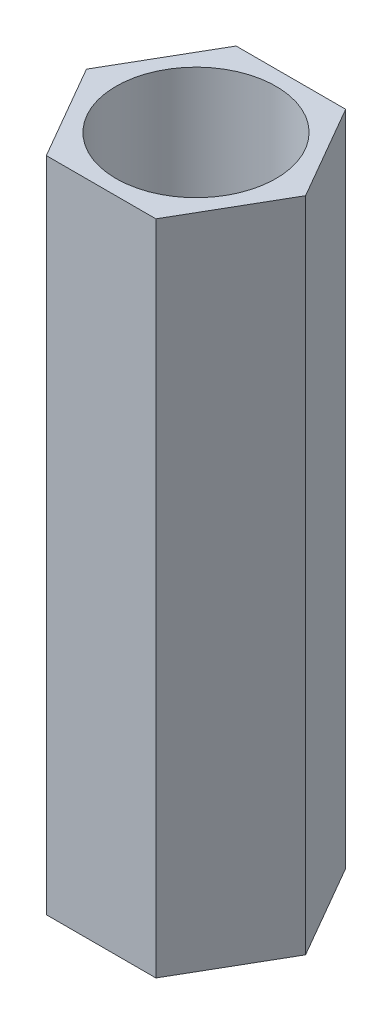
ISO-10303-21;
HEADER;
FILE_DESCRIPTION(('STEP AP214'),'2;1');
FILE_NAME('part.step','',(''),(''),'','','');
FILE_SCHEMA(('AUTOMOTIVE_DESIGN { 1 0 10303 214 1 1 1 1 }'));
ENDSEC;
DATA;
#1=APPLICATION_CONTEXT('core data for automotive mechanical design processes');
#2=APPLICATION_PROTOCOL_DEFINITION('international standard','automotive_design',2000,#1);
#3=PRODUCT_CONTEXT('',#1,'mechanical');
#4=PRODUCT('Part','Part','',(#3));
#5=PRODUCT_RELATED_PRODUCT_CATEGORY('part','',(#4));
#6=PRODUCT_DEFINITION_FORMATION('','',#4);
#7=PRODUCT_DEFINITION_CONTEXT('part definition',#1,'design');
#8=PRODUCT_DEFINITION('design','',#6,#7);
#9=PRODUCT_DEFINITION_SHAPE('','',#8);
#10=(LENGTH_UNIT() NAMED_UNIT(*) SI_UNIT(.MILLI.,.METRE.));
#11=(NAMED_UNIT(*) PLANE_ANGLE_UNIT() SI_UNIT($,.RADIAN.));
#12=(NAMED_UNIT(*) SI_UNIT($,.STERADIAN.) SOLID_ANGLE_UNIT());
#13=UNCERTAINTY_MEASURE_WITH_UNIT(LENGTH_MEASURE(1.E-05),#10,'distance_accuracy_value','');
#14=(GEOMETRIC_REPRESENTATION_CONTEXT(3) GLOBAL_UNCERTAINTY_ASSIGNED_CONTEXT((#13)) GLOBAL_UNIT_ASSIGNED_CONTEXT((#10,
#11,#12)) REPRESENTATION_CONTEXT('',''));
#15=CARTESIAN_POINT('',(0.,0.,0.));
#16=DIRECTION('',(0.,0.,1.));
#17=DIRECTION('',(1.,0.,0.));
#18=AXIS2_PLACEMENT_3D('',#15,#16,#17);
#19=CARTESIAN_POINT('',(0.,15.,0.));
#20=DIRECTION('',(0.,1.,0.));
#21=DIRECTION('',(0.,0.,1.));
#22=AXIS2_PLACEMENT_3D('',#19,#20,#21);
#23=PLANE('',#22);
#24=DIRECTION('',(0.5,0.,-0.866025403784439));
#25=VECTOR('',#24,1.);
#26=CARTESIAN_POINT('',(1.25,15.,2.1650635094611));
#27=LINE('',#26,#25);
#28=CARTESIAN_POINT('',(1.25,15.,2.1650635094611));
#29=VERTEX_POINT('',#28);
#30=CARTESIAN_POINT('',(2.5,15.,0.));
#31=VERTEX_POINT('',#30);
#32=EDGE_CURVE('E152',#29,#31,#27,.T.);
#33=ORIENTED_EDGE('',*,*,#32,.T.);
#34=DIRECTION('',(-0.5,0.,-0.866025403784439));
#35=VECTOR('',#34,1.);
#36=CARTESIAN_POINT('',(2.5,15.,0.));
#37=LINE('',#36,#35);
#38=CARTESIAN_POINT('',(1.25,15.,-2.1650635094611));
#39=VERTEX_POINT('',#38);
#40=EDGE_CURVE('E100',#31,#39,#37,.T.);
#41=ORIENTED_EDGE('',*,*,#40,.T.);
#42=DIRECTION('',(-1.,0.,0.));
#43=VECTOR('',#42,1.);
#44=CARTESIAN_POINT('',(1.25,15.,-2.1650635094611));
#45=LINE('',#44,#43);
#46=CARTESIAN_POINT('',(-1.25,15.,-2.1650635094611));
#47=VERTEX_POINT('',#46);
#48=EDGE_CURVE('E113',#39,#47,#45,.T.);
#49=ORIENTED_EDGE('',*,*,#48,.T.);
#50=DIRECTION('',(-0.5,0.,0.866025403784439));
#51=VECTOR('',#50,1.);
#52=CARTESIAN_POINT('',(-1.25,15.,-2.1650635094611));
#53=LINE('',#52,#51);
#54=CARTESIAN_POINT('',(-2.5,15.,0.));
#55=VERTEX_POINT('',#54);
#56=EDGE_CURVE('E107',#47,#55,#53,.T.);
#57=ORIENTED_EDGE('',*,*,#56,.T.);
#58=DIRECTION('',(0.5,0.,0.866025403784439));
#59=VECTOR('',#58,1.);
#60=CARTESIAN_POINT('',(-2.5,15.,0.));
#61=LINE('',#60,#59);
#62=CARTESIAN_POINT('',(-1.25,15.,2.1650635094611));
#63=VERTEX_POINT('',#62);
#64=EDGE_CURVE('E111',#55,#63,#61,.T.);
#65=ORIENTED_EDGE('',*,*,#64,.T.);
#66=DIRECTION('',(1.,0.,0.));
#67=VECTOR('',#66,1.);
#68=CARTESIAN_POINT('',(-1.25,15.,2.1650635094611));
#69=LINE('',#68,#67);
#70=EDGE_CURVE('E63',#63,#29,#69,.T.);
#71=ORIENTED_EDGE('',*,*,#70,.T.);
#72=EDGE_LOOP('',(#33,#41,#49,#57,#65,#71));
#73=FACE_BOUND('',#72,.T.);
#74=CARTESIAN_POINT('',(0.,15.,0.));
#75=DIRECTION('',(0.,1.,0.));
#76=DIRECTION('',(0.,0.,1.));
#77=AXIS2_PLACEMENT_3D('',#74,#75,#76);
#78=CIRCLE('',#77,1.825);
#79=CARTESIAN_POINT('',(0.,15.,1.825));
#80=VERTEX_POINT('',#79);
#81=EDGE_CURVE('E140',#80,#80,#78,.T.);
#82=ORIENTED_EDGE('',*,*,#81,.F.);
#83=EDGE_LOOP('',(#82));
#84=FACE_BOUND('',#83,.T.);
#85=ADVANCED_FACE('F45',(#73,#84),#23,.T.);
#86=CARTESIAN_POINT('',(0.,0.,0.));
#87=DIRECTION('',(0.,1.,0.));
#88=DIRECTION('',(0.,0.,1.));
#89=AXIS2_PLACEMENT_3D('',#86,#87,#88);
#90=PLANE('',#89);
#91=DIRECTION('',(0.5,0.,-0.866025403784439));
#92=VECTOR('',#91,1.);
#93=CARTESIAN_POINT('',(1.25,0.,2.1650635094611));
#94=LINE('',#93,#92);
#95=CARTESIAN_POINT('',(1.25,0.,2.1650635094611));
#96=VERTEX_POINT('',#95);
#97=CARTESIAN_POINT('',(2.5,0.,0.));
#98=VERTEX_POINT('',#97);
#99=EDGE_CURVE('E135',#96,#98,#94,.T.);
#100=ORIENTED_EDGE('',*,*,#99,.F.);
#101=DIRECTION('',(1.,0.,0.));
#102=VECTOR('',#101,1.);
#103=CARTESIAN_POINT('',(-1.25,0.,2.1650635094611));
#104=LINE('',#103,#102);
#105=CARTESIAN_POINT('',(-1.25,0.,2.1650635094611));
#106=VERTEX_POINT('',#105);
#107=EDGE_CURVE('E92',#106,#96,#104,.T.);
#108=ORIENTED_EDGE('',*,*,#107,.F.);
#109=DIRECTION('',(0.5,0.,0.866025403784439));
#110=VECTOR('',#109,1.);
#111=CARTESIAN_POINT('',(-2.5,0.,0.));
#112=LINE('',#111,#110);
#113=CARTESIAN_POINT('',(-2.5,0.,0.));
#114=VERTEX_POINT('',#113);
#115=EDGE_CURVE('E86',#114,#106,#112,.T.);
#116=ORIENTED_EDGE('',*,*,#115,.F.);
#117=DIRECTION('',(-0.5,0.,0.866025403784439));
#118=VECTOR('',#117,1.);
#119=CARTESIAN_POINT('',(-1.25,0.,-2.1650635094611));
#120=LINE('',#119,#118);
#121=CARTESIAN_POINT('',(-1.25,0.,-2.1650635094611));
#122=VERTEX_POINT('',#121);
#123=EDGE_CURVE('E122',#122,#114,#120,.T.);
#124=ORIENTED_EDGE('',*,*,#123,.F.);
#125=DIRECTION('',(-1.,0.,0.));
#126=VECTOR('',#125,1.);
#127=CARTESIAN_POINT('',(1.25,0.,-2.1650635094611));
#128=LINE('',#127,#126);
#129=CARTESIAN_POINT('',(1.25,0.,-2.1650635094611));
#130=VERTEX_POINT('',#129);
#131=EDGE_CURVE('E143',#130,#122,#128,.T.);
#132=ORIENTED_EDGE('',*,*,#131,.F.);
#133=DIRECTION('',(-0.5,0.,-0.866025403784439));
#134=VECTOR('',#133,1.);
#135=CARTESIAN_POINT('',(2.5,0.,0.));
#136=LINE('',#135,#134);
#137=EDGE_CURVE('E139',#98,#130,#136,.T.);
#138=ORIENTED_EDGE('',*,*,#137,.F.);
#139=EDGE_LOOP('',(#100,#108,#116,#124,#132,#138));
#140=FACE_BOUND('',#139,.T.);
#141=CARTESIAN_POINT('',(0.,0.,0.));
#142=DIRECTION('',(0.,1.,0.));
#143=DIRECTION('',(0.,0.,1.));
#144=AXIS2_PLACEMENT_3D('',#141,#142,#143);
#145=CIRCLE('',#144,1.825);
#146=CARTESIAN_POINT('',(0.,0.,1.825));
#147=VERTEX_POINT('',#146);
#148=EDGE_CURVE('E249',#147,#147,#145,.T.);
#149=ORIENTED_EDGE('',*,*,#148,.T.);
#150=EDGE_LOOP('',(#149));
#151=FACE_BOUND('',#150,.T.);
#152=ADVANCED_FACE('F165',(#140,#151),#90,.F.);
#153=CARTESIAN_POINT('',(1.25,15.,2.1650635094611));
#154=DIRECTION('',(-0.866025403784439,0.,-0.5));
#155=DIRECTION('',(-0.5,0.,0.866025403784439));
#156=AXIS2_PLACEMENT_3D('',#153,#154,#155);
#157=PLANE('',#156);
#158=ORIENTED_EDGE('',*,*,#99,.T.);
#159=DIRECTION('',(0.,-1.,0.));
#160=VECTOR('',#159,1.);
#161=CARTESIAN_POINT('',(2.5,15.,0.));
#162=LINE('',#161,#160);
#163=EDGE_CURVE('E11',#31,#98,#162,.T.);
#164=ORIENTED_EDGE('',*,*,#163,.F.);
#165=ORIENTED_EDGE('',*,*,#32,.F.);
#166=DIRECTION('',(0.,-1.,0.));
#167=VECTOR('',#166,1.);
#168=CARTESIAN_POINT('',(1.25,15.,2.1650635094611));
#169=LINE('',#168,#167);
#170=EDGE_CURVE('E131',#29,#96,#169,.T.);
#171=ORIENTED_EDGE('',*,*,#170,.T.);
#172=EDGE_LOOP('',(#158,#164,#165,#171));
#173=FACE_BOUND('',#172,.T.);
#174=ADVANCED_FACE('F47',(#173),#157,.F.);
#175=CARTESIAN_POINT('',(2.5,15.,0.));
#176=DIRECTION('',(-0.866025403784439,0.,0.5));
#177=DIRECTION('',(0.5,0.,0.866025403784439));
#178=AXIS2_PLACEMENT_3D('',#175,#176,#177);
#179=PLANE('',#178);
#180=ORIENTED_EDGE('',*,*,#137,.T.);
#181=DIRECTION('',(0.,-1.,0.));
#182=VECTOR('',#181,1.);
#183=CARTESIAN_POINT('',(1.25,15.,-2.1650635094611));
#184=LINE('',#183,#182);
#185=EDGE_CURVE('E55',#39,#130,#184,.T.);
#186=ORIENTED_EDGE('',*,*,#185,.F.);
#187=ORIENTED_EDGE('',*,*,#40,.F.);
#188=ORIENTED_EDGE('',*,*,#163,.T.);
#189=EDGE_LOOP('',(#180,#186,#187,#188));
#190=FACE_BOUND('',#189,.T.);
#191=ADVANCED_FACE('F190',(#190),#179,.F.);
#192=CARTESIAN_POINT('',(1.25,15.,-2.1650635094611));
#193=DIRECTION('',(0.,0.,1.));
#194=DIRECTION('',(1.,0.,0.));
#195=AXIS2_PLACEMENT_3D('',#192,#193,#194);
#196=PLANE('',#195);
#197=ORIENTED_EDGE('',*,*,#131,.T.);
#198=DIRECTION('',(0.,-1.,0.));
#199=VECTOR('',#198,1.);
#200=CARTESIAN_POINT('',(-1.25,15.,-2.1650635094611));
#201=LINE('',#200,#199);
#202=EDGE_CURVE('E124',#47,#122,#201,.T.);
#203=ORIENTED_EDGE('',*,*,#202,.F.);
#204=ORIENTED_EDGE('',*,*,#48,.F.);
#205=ORIENTED_EDGE('',*,*,#185,.T.);
#206=EDGE_LOOP('',(#197,#203,#204,#205));
#207=FACE_BOUND('',#206,.T.);
#208=ADVANCED_FACE('F162',(#207),#196,.F.);
#209=CARTESIAN_POINT('',(-1.25,15.,-2.1650635094611));
#210=DIRECTION('',(0.866025403784439,0.,0.5));
#211=DIRECTION('',(0.5,0.,-0.866025403784439));
#212=AXIS2_PLACEMENT_3D('',#209,#210,#211);
#213=PLANE('',#212);
#214=ORIENTED_EDGE('',*,*,#123,.T.);
#215=DIRECTION('',(0.,-1.,0.));
#216=VECTOR('',#215,1.);
#217=CARTESIAN_POINT('',(-2.5,15.,0.));
#218=LINE('',#217,#216);
#219=EDGE_CURVE('E119',#55,#114,#218,.T.);
#220=ORIENTED_EDGE('',*,*,#219,.F.);
#221=ORIENTED_EDGE('',*,*,#56,.F.);
#222=ORIENTED_EDGE('',*,*,#202,.T.);
#223=EDGE_LOOP('',(#214,#220,#221,#222));
#224=FACE_BOUND('',#223,.T.);
#225=ADVANCED_FACE('F120',(#224),#213,.F.);
#226=CARTESIAN_POINT('',(-2.5,15.,0.));
#227=DIRECTION('',(0.866025403784439,0.,-0.5));
#228=DIRECTION('',(-0.5,0.,-0.866025403784439));
#229=AXIS2_PLACEMENT_3D('',#226,#227,#228);
#230=PLANE('',#229);
#231=ORIENTED_EDGE('',*,*,#115,.T.);
#232=DIRECTION('',(0.,-1.,0.));
#233=VECTOR('',#232,1.);
#234=CARTESIAN_POINT('',(-1.25,15.,2.1650635094611));
#235=LINE('',#234,#233);
#236=EDGE_CURVE('E125',#63,#106,#235,.T.);
#237=ORIENTED_EDGE('',*,*,#236,.F.);
#238=ORIENTED_EDGE('',*,*,#64,.F.);
#239=ORIENTED_EDGE('',*,*,#219,.T.);
#240=EDGE_LOOP('',(#231,#237,#238,#239));
#241=FACE_BOUND('',#240,.T.);
#242=ADVANCED_FACE('F127',(#241),#230,.F.);
#243=CARTESIAN_POINT('',(-1.25,15.,2.1650635094611));
#244=DIRECTION('',(0.,0.,-1.));
#245=DIRECTION('',(-1.,0.,0.));
#246=AXIS2_PLACEMENT_3D('',#243,#244,#245);
#247=PLANE('',#246);
#248=ORIENTED_EDGE('',*,*,#107,.T.);
#249=ORIENTED_EDGE('',*,*,#170,.F.);
#250=ORIENTED_EDGE('',*,*,#70,.F.);
#251=ORIENTED_EDGE('',*,*,#236,.T.);
#252=EDGE_LOOP('',(#248,#249,#250,#251));
#253=FACE_BOUND('',#252,.T.);
#254=ADVANCED_FACE('F170',(#253),#247,.F.);
#255=CARTESIAN_POINT('',(0.,15.,0.));
#256=DIRECTION('',(0.,-1.,0.));
#257=DIRECTION('',(0.,0.,-1.));
#258=AXIS2_PLACEMENT_3D('',#255,#256,#257);
#259=CYLINDRICAL_SURFACE('',#258,1.825);
#260=ORIENTED_EDGE('',*,*,#81,.T.);
#261=EDGE_LOOP('',(#260));
#262=FACE_BOUND('',#261,.T.);
#263=ORIENTED_EDGE('',*,*,#148,.F.);
#264=EDGE_LOOP('',(#263));
#265=FACE_BOUND('',#264,.T.);
#266=ADVANCED_FACE('F172',(#262,#265),#259,.F.);
#267=CLOSED_SHELL('',(#85,#152,#174,#191,#208,#225,#242,#254,#266));
#268=MANIFOLD_SOLID_BREP('B2',#267);
#269=ADVANCED_BREP_SHAPE_REPRESENTATION('',(#18,#268),#14);
#270=SHAPE_DEFINITION_REPRESENTATION(#9,#269);
ENDSEC;
END-ISO-10303-21;
